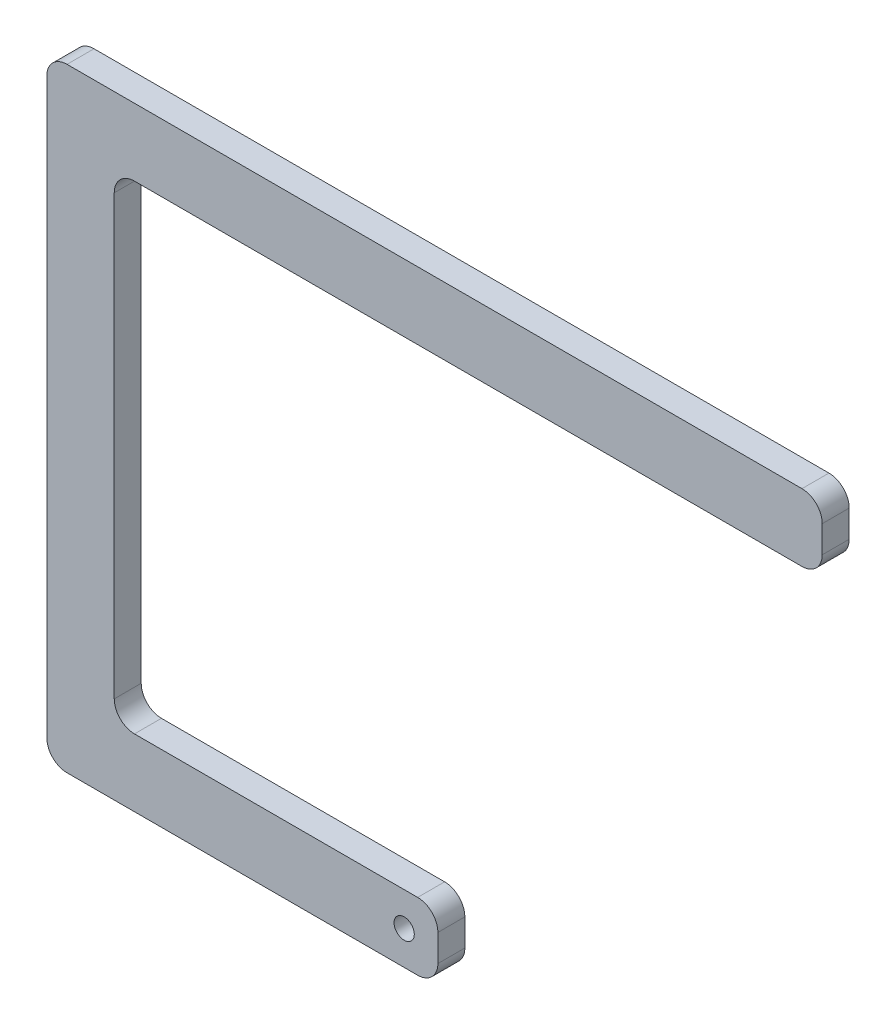
ISO-10303-21;
HEADER;
FILE_DESCRIPTION(('STEP AP214'),'2;1');
FILE_NAME('part.step','',(''),(''),'','','');
FILE_SCHEMA(('AUTOMOTIVE_DESIGN { 1 0 10303 214 1 1 1 1 }'));
ENDSEC;
DATA;
#1=APPLICATION_CONTEXT('core data for automotive mechanical design processes');
#2=APPLICATION_PROTOCOL_DEFINITION('international standard','automotive_design',2000,#1);
#3=PRODUCT_CONTEXT('',#1,'mechanical');
#4=PRODUCT('Part','Part','',(#3));
#5=PRODUCT_RELATED_PRODUCT_CATEGORY('part','',(#4));
#6=PRODUCT_DEFINITION_FORMATION('','',#4);
#7=PRODUCT_DEFINITION_CONTEXT('part definition',#1,'design');
#8=PRODUCT_DEFINITION('design','',#6,#7);
#9=PRODUCT_DEFINITION_SHAPE('','',#8);
#10=(LENGTH_UNIT() NAMED_UNIT(*) SI_UNIT(.MILLI.,.METRE.));
#11=(NAMED_UNIT(*) PLANE_ANGLE_UNIT() SI_UNIT($,.RADIAN.));
#12=(NAMED_UNIT(*) SI_UNIT($,.STERADIAN.) SOLID_ANGLE_UNIT());
#13=UNCERTAINTY_MEASURE_WITH_UNIT(LENGTH_MEASURE(1.E-05),#10,'distance_accuracy_value','');
#14=(GEOMETRIC_REPRESENTATION_CONTEXT(3) GLOBAL_UNCERTAINTY_ASSIGNED_CONTEXT((#13)) GLOBAL_UNIT_ASSIGNED_CONTEXT((#10,
#11,#12)) REPRESENTATION_CONTEXT('',''));
#15=CARTESIAN_POINT('',(0.,0.,0.));
#16=DIRECTION('',(0.,0.,1.));
#17=DIRECTION('',(1.,0.,0.));
#18=AXIS2_PLACEMENT_3D('',#15,#16,#17);
#19=CARTESIAN_POINT('',(-55.,78.,4.));
#20=DIRECTION('',(0.,0.,-1.));
#21=DIRECTION('',(-1.,0.,0.));
#22=AXIS2_PLACEMENT_3D('',#19,#20,#21);
#23=PLANE('',#22);
#24=CARTESIAN_POINT('',(-55.,78.,4.));
#25=DIRECTION('',(0.,0.,1.));
#26=DIRECTION('',(-1.,0.,0.));
#27=AXIS2_PLACEMENT_3D('',#24,#25,#26);
#28=CIRCLE('',#27,3.);
#29=CARTESIAN_POINT('',(-55.,81.,4.));
#30=VERTEX_POINT('',#29);
#31=CARTESIAN_POINT('',(-58.,78.,4.));
#32=VERTEX_POINT('',#31);
#33=EDGE_CURVE('E209',#30,#32,#28,.T.);
#34=ORIENTED_EDGE('',*,*,#33,.T.);
#35=DIRECTION('',(0.,-1.,0.));
#36=VECTOR('',#35,1.);
#37=CARTESIAN_POINT('',(-58.,-7.00000000000001,4.));
#38=LINE('',#37,#36);
#39=CARTESIAN_POINT('',(-58.,-7.00000000000001,4.));
#40=VERTEX_POINT('',#39);
#41=EDGE_CURVE('E117',#32,#40,#38,.T.);
#42=ORIENTED_EDGE('',*,*,#41,.T.);
#43=CARTESIAN_POINT('',(-55.,-7.00000000000001,4.));
#44=DIRECTION('',(0.,0.,1.));
#45=DIRECTION('',(-1.,0.,0.));
#46=AXIS2_PLACEMENT_3D('',#43,#44,#45);
#47=CIRCLE('',#46,3.);
#48=CARTESIAN_POINT('',(-55.,-10.,4.));
#49=VERTEX_POINT('',#48);
#50=EDGE_CURVE('E248',#40,#49,#47,.T.);
#51=ORIENTED_EDGE('',*,*,#50,.T.);
#52=DIRECTION('',(1.,0.,0.));
#53=VECTOR('',#52,1.);
#54=CARTESIAN_POINT('',(-3.00000000000002,-10.,4.));
#55=LINE('',#54,#53);
#56=CARTESIAN_POINT('',(-3.00000000000002,-10.,4.));
#57=VERTEX_POINT('',#56);
#58=EDGE_CURVE('E267',#49,#57,#55,.T.);
#59=ORIENTED_EDGE('',*,*,#58,.T.);
#60=CARTESIAN_POINT('',(-3.,-7.,4.));
#61=DIRECTION('',(0.,0.,1.));
#62=DIRECTION('',(1.,0.,0.));
#63=AXIS2_PLACEMENT_3D('',#60,#61,#62);
#64=CIRCLE('',#63,3.);
#65=CARTESIAN_POINT('',(0.,-7.,4.));
#66=VERTEX_POINT('',#65);
#67=EDGE_CURVE('E264',#57,#66,#64,.T.);
#68=ORIENTED_EDGE('',*,*,#67,.T.);
#69=DIRECTION('',(0.,1.,0.));
#70=VECTOR('',#69,1.);
#71=CARTESIAN_POINT('',(0.,-3.,4.));
#72=LINE('',#71,#70);
#73=CARTESIAN_POINT('',(0.,-3.,4.));
#74=VERTEX_POINT('',#73);
#75=EDGE_CURVE('E266',#66,#74,#72,.T.);
#76=ORIENTED_EDGE('',*,*,#75,.T.);
#77=CARTESIAN_POINT('',(-3.,-3.,4.));
#78=DIRECTION('',(0.,0.,1.));
#79=DIRECTION('',(-1.,0.,0.));
#80=AXIS2_PLACEMENT_3D('',#77,#78,#79);
#81=CIRCLE('',#80,3.);
#82=CARTESIAN_POINT('',(-3.,0.,4.));
#83=VERTEX_POINT('',#82);
#84=EDGE_CURVE('E269',#74,#83,#81,.T.);
#85=ORIENTED_EDGE('',*,*,#84,.T.);
#86=DIRECTION('',(-1.,0.,0.));
#87=VECTOR('',#86,1.);
#88=CARTESIAN_POINT('',(-3.,0.,4.));
#89=LINE('',#88,#87);
#90=CARTESIAN_POINT('',(-45.,0.,4.));
#91=VERTEX_POINT('',#90);
#92=EDGE_CURVE('E275',#83,#91,#89,.T.);
#93=ORIENTED_EDGE('',*,*,#92,.T.);
#94=CARTESIAN_POINT('',(-45.,2.99999999999999,4.));
#95=DIRECTION('',(0.,0.,-1.));
#96=DIRECTION('',(-1.,0.,0.));
#97=AXIS2_PLACEMENT_3D('',#94,#95,#96);
#98=CIRCLE('',#97,3.);
#99=CARTESIAN_POINT('',(-48.,2.99999999999999,4.));
#100=VERTEX_POINT('',#99);
#101=EDGE_CURVE('E277',#91,#100,#98,.T.);
#102=ORIENTED_EDGE('',*,*,#101,.T.);
#103=DIRECTION('',(0.,1.,0.));
#104=VECTOR('',#103,1.);
#105=CARTESIAN_POINT('',(-48.,2.99999999999999,4.));
#106=LINE('',#105,#104);
#107=CARTESIAN_POINT('',(-48.,68.,4.));
#108=VERTEX_POINT('',#107);
#109=EDGE_CURVE('E279',#100,#108,#106,.T.);
#110=ORIENTED_EDGE('',*,*,#109,.T.);
#111=CARTESIAN_POINT('',(-45.,68.,4.));
#112=DIRECTION('',(0.,0.,-1.));
#113=DIRECTION('',(-1.,0.,0.));
#114=AXIS2_PLACEMENT_3D('',#111,#112,#113);
#115=CIRCLE('',#114,3.);
#116=CARTESIAN_POINT('',(-45.,71.,4.));
#117=VERTEX_POINT('',#116);
#118=EDGE_CURVE('E281',#108,#117,#115,.T.);
#119=ORIENTED_EDGE('',*,*,#118,.T.);
#120=DIRECTION('',(1.,0.,0.));
#121=VECTOR('',#120,1.);
#122=CARTESIAN_POINT('',(-45.,71.,4.));
#123=LINE('',#122,#121);
#124=CARTESIAN_POINT('',(54.,71.,4.));
#125=VERTEX_POINT('',#124);
#126=EDGE_CURVE('E283',#117,#125,#123,.T.);
#127=ORIENTED_EDGE('',*,*,#126,.T.);
#128=CARTESIAN_POINT('',(54.,74.,4.));
#129=DIRECTION('',(0.,0.,1.));
#130=DIRECTION('',(1.,0.,0.));
#131=AXIS2_PLACEMENT_3D('',#128,#129,#130);
#132=CIRCLE('',#131,3.);
#133=CARTESIAN_POINT('',(57.,74.,4.));
#134=VERTEX_POINT('',#133);
#135=EDGE_CURVE('E160',#125,#134,#132,.T.);
#136=ORIENTED_EDGE('',*,*,#135,.T.);
#137=DIRECTION('',(0.,1.,0.));
#138=VECTOR('',#137,1.);
#139=CARTESIAN_POINT('',(57.,74.,4.));
#140=LINE('',#139,#138);
#141=CARTESIAN_POINT('',(57.,78.,4.));
#142=VERTEX_POINT('',#141);
#143=EDGE_CURVE('E154',#134,#142,#140,.T.);
#144=ORIENTED_EDGE('',*,*,#143,.T.);
#145=CARTESIAN_POINT('',(54.,78.,4.));
#146=DIRECTION('',(0.,0.,1.));
#147=DIRECTION('',(-1.,0.,0.));
#148=AXIS2_PLACEMENT_3D('',#145,#146,#147);
#149=CIRCLE('',#148,3.);
#150=CARTESIAN_POINT('',(54.,81.,4.));
#151=VERTEX_POINT('',#150);
#152=EDGE_CURVE('E158',#142,#151,#149,.T.);
#153=ORIENTED_EDGE('',*,*,#152,.T.);
#154=DIRECTION('',(-1.,0.,0.));
#155=VECTOR('',#154,1.);
#156=CARTESIAN_POINT('',(-55.,81.,4.));
#157=LINE('',#156,#155);
#158=EDGE_CURVE('E50',#151,#30,#157,.T.);
#159=ORIENTED_EDGE('',*,*,#158,.T.);
#160=EDGE_LOOP('',(#34,#42,#51,#59,#68,#76,#85,#93,#102,#110,#119,#127,#136,#144,#153,#159));
#161=FACE_BOUND('',#160,.T.);
#162=CARTESIAN_POINT('',(-5.,-5.,4.));
#163=DIRECTION('',(0.,0.,1.));
#164=DIRECTION('',(1.,0.,0.));
#165=AXIS2_PLACEMENT_3D('',#162,#163,#164);
#166=CIRCLE('',#165,1.5);
#167=CARTESIAN_POINT('',(-3.5,-5.,4.));
#168=VERTEX_POINT('',#167);
#169=EDGE_CURVE('E182',#168,#168,#166,.T.);
#170=ORIENTED_EDGE('',*,*,#169,.F.);
#171=EDGE_LOOP('',(#170));
#172=FACE_BOUND('',#171,.T.);
#173=ADVANCED_FACE('F33',(#161,#172),#23,.F.);
#174=CARTESIAN_POINT('',(-55.,78.,0.));
#175=DIRECTION('',(0.,0.,-1.));
#176=DIRECTION('',(-1.,0.,0.));
#177=AXIS2_PLACEMENT_3D('',#174,#175,#176);
#178=PLANE('',#177);
#179=CARTESIAN_POINT('',(-55.,78.,0.));
#180=DIRECTION('',(0.,0.,1.));
#181=DIRECTION('',(-1.,0.,0.));
#182=AXIS2_PLACEMENT_3D('',#179,#180,#181);
#183=CIRCLE('',#182,3.);
#184=CARTESIAN_POINT('',(-55.,81.,0.));
#185=VERTEX_POINT('',#184);
#186=CARTESIAN_POINT('',(-58.,78.,0.));
#187=VERTEX_POINT('',#186);
#188=EDGE_CURVE('E178',#185,#187,#183,.T.);
#189=ORIENTED_EDGE('',*,*,#188,.F.);
#190=DIRECTION('',(-1.,0.,0.));
#191=VECTOR('',#190,1.);
#192=CARTESIAN_POINT('',(-55.,81.,0.));
#193=LINE('',#192,#191);
#194=CARTESIAN_POINT('',(54.,81.,0.));
#195=VERTEX_POINT('',#194);
#196=EDGE_CURVE('E109',#195,#185,#193,.T.);
#197=ORIENTED_EDGE('',*,*,#196,.F.);
#198=CARTESIAN_POINT('',(54.,78.,0.));
#199=DIRECTION('',(0.,0.,1.));
#200=DIRECTION('',(-1.,0.,0.));
#201=AXIS2_PLACEMENT_3D('',#198,#199,#200);
#202=CIRCLE('',#201,3.);
#203=CARTESIAN_POINT('',(57.,78.,0.));
#204=VERTEX_POINT('',#203);
#205=EDGE_CURVE('E103',#204,#195,#202,.T.);
#206=ORIENTED_EDGE('',*,*,#205,.F.);
#207=DIRECTION('',(0.,1.,0.));
#208=VECTOR('',#207,1.);
#209=CARTESIAN_POINT('',(57.,74.,0.));
#210=LINE('',#209,#208);
#211=CARTESIAN_POINT('',(57.,74.,0.));
#212=VERTEX_POINT('',#211);
#213=EDGE_CURVE('E168',#212,#204,#210,.T.);
#214=ORIENTED_EDGE('',*,*,#213,.F.);
#215=CARTESIAN_POINT('',(54.,74.,0.));
#216=DIRECTION('',(0.,0.,1.));
#217=DIRECTION('',(1.,0.,0.));
#218=AXIS2_PLACEMENT_3D('',#215,#216,#217);
#219=CIRCLE('',#218,3.);
#220=CARTESIAN_POINT('',(54.,71.,0.));
#221=VERTEX_POINT('',#220);
#222=EDGE_CURVE('E204',#221,#212,#219,.T.);
#223=ORIENTED_EDGE('',*,*,#222,.F.);
#224=DIRECTION('',(1.,0.,0.));
#225=VECTOR('',#224,1.);
#226=CARTESIAN_POINT('',(-45.,71.,0.));
#227=LINE('',#226,#225);
#228=CARTESIAN_POINT('',(-45.,71.,0.));
#229=VERTEX_POINT('',#228);
#230=EDGE_CURVE('E202',#229,#221,#227,.T.);
#231=ORIENTED_EDGE('',*,*,#230,.F.);
#232=CARTESIAN_POINT('',(-45.,68.,0.));
#233=DIRECTION('',(0.,0.,-1.));
#234=DIRECTION('',(-1.,0.,0.));
#235=AXIS2_PLACEMENT_3D('',#232,#233,#234);
#236=CIRCLE('',#235,3.);
#237=CARTESIAN_POINT('',(-48.,68.,0.));
#238=VERTEX_POINT('',#237);
#239=EDGE_CURVE('E200',#238,#229,#236,.T.);
#240=ORIENTED_EDGE('',*,*,#239,.F.);
#241=DIRECTION('',(0.,1.,0.));
#242=VECTOR('',#241,1.);
#243=CARTESIAN_POINT('',(-48.,2.99999999999999,0.));
#244=LINE('',#243,#242);
#245=CARTESIAN_POINT('',(-48.,2.99999999999999,0.));
#246=VERTEX_POINT('',#245);
#247=EDGE_CURVE('E198',#246,#238,#244,.T.);
#248=ORIENTED_EDGE('',*,*,#247,.F.);
#249=CARTESIAN_POINT('',(-45.,2.99999999999999,0.));
#250=DIRECTION('',(0.,0.,-1.));
#251=DIRECTION('',(-1.,0.,0.));
#252=AXIS2_PLACEMENT_3D('',#249,#250,#251);
#253=CIRCLE('',#252,3.);
#254=CARTESIAN_POINT('',(-45.,0.,0.));
#255=VERTEX_POINT('',#254);
#256=EDGE_CURVE('E196',#255,#246,#253,.T.);
#257=ORIENTED_EDGE('',*,*,#256,.F.);
#258=DIRECTION('',(-1.,0.,0.));
#259=VECTOR('',#258,1.);
#260=CARTESIAN_POINT('',(-3.,0.,0.));
#261=LINE('',#260,#259);
#262=CARTESIAN_POINT('',(-3.,0.,0.));
#263=VERTEX_POINT('',#262);
#264=EDGE_CURVE('E194',#263,#255,#261,.T.);
#265=ORIENTED_EDGE('',*,*,#264,.F.);
#266=CARTESIAN_POINT('',(-3.,-3.,0.));
#267=DIRECTION('',(0.,0.,1.));
#268=DIRECTION('',(-1.,0.,0.));
#269=AXIS2_PLACEMENT_3D('',#266,#267,#268);
#270=CIRCLE('',#269,3.);
#271=CARTESIAN_POINT('',(0.,-3.,0.));
#272=VERTEX_POINT('',#271);
#273=EDGE_CURVE('E192',#272,#263,#270,.T.);
#274=ORIENTED_EDGE('',*,*,#273,.F.);
#275=DIRECTION('',(0.,1.,0.));
#276=VECTOR('',#275,1.);
#277=CARTESIAN_POINT('',(0.,-3.,0.));
#278=LINE('',#277,#276);
#279=CARTESIAN_POINT('',(0.,-7.,0.));
#280=VERTEX_POINT('',#279);
#281=EDGE_CURVE('E190',#280,#272,#278,.T.);
#282=ORIENTED_EDGE('',*,*,#281,.F.);
#283=CARTESIAN_POINT('',(-3.,-7.,0.));
#284=DIRECTION('',(0.,0.,1.));
#285=DIRECTION('',(1.,0.,0.));
#286=AXIS2_PLACEMENT_3D('',#283,#284,#285);
#287=CIRCLE('',#286,3.);
#288=CARTESIAN_POINT('',(-3.00000000000002,-10.,0.));
#289=VERTEX_POINT('',#288);
#290=EDGE_CURVE('E188',#289,#280,#287,.T.);
#291=ORIENTED_EDGE('',*,*,#290,.F.);
#292=DIRECTION('',(1.,0.,0.));
#293=VECTOR('',#292,1.);
#294=CARTESIAN_POINT('',(-3.00000000000002,-10.,0.));
#295=LINE('',#294,#293);
#296=CARTESIAN_POINT('',(-55.,-10.,0.));
#297=VERTEX_POINT('',#296);
#298=EDGE_CURVE('E186',#297,#289,#295,.T.);
#299=ORIENTED_EDGE('',*,*,#298,.F.);
#300=CARTESIAN_POINT('',(-55.,-7.00000000000001,0.));
#301=DIRECTION('',(0.,0.,1.));
#302=DIRECTION('',(-1.,0.,0.));
#303=AXIS2_PLACEMENT_3D('',#300,#301,#302);
#304=CIRCLE('',#303,3.);
#305=CARTESIAN_POINT('',(-58.,-7.00000000000001,0.));
#306=VERTEX_POINT('',#305);
#307=EDGE_CURVE('E184',#306,#297,#304,.T.);
#308=ORIENTED_EDGE('',*,*,#307,.F.);
#309=DIRECTION('',(0.,-1.,0.));
#310=VECTOR('',#309,1.);
#311=CARTESIAN_POINT('',(-58.,-7.00000000000001,0.));
#312=LINE('',#311,#310);
#313=EDGE_CURVE('E181',#187,#306,#312,.T.);
#314=ORIENTED_EDGE('',*,*,#313,.F.);
#315=EDGE_LOOP('',(#189,#197,#206,#214,#223,#231,#240,#248,#257,#265,#274,#282,#291,#299,#308,#314));
#316=FACE_BOUND('',#315,.T.);
#317=CARTESIAN_POINT('',(-5.,-5.,0.));
#318=DIRECTION('',(0.,0.,1.));
#319=DIRECTION('',(1.,0.,0.));
#320=AXIS2_PLACEMENT_3D('',#317,#318,#319);
#321=CIRCLE('',#320,1.5);
#322=CARTESIAN_POINT('',(-3.5,-5.,0.));
#323=VERTEX_POINT('',#322);
#324=EDGE_CURVE('E482',#323,#323,#321,.T.);
#325=ORIENTED_EDGE('',*,*,#324,.T.);
#326=EDGE_LOOP('',(#325));
#327=FACE_BOUND('',#326,.T.);
#328=ADVANCED_FACE('F252',(#316,#327),#178,.T.);
#329=CARTESIAN_POINT('',(-55.,78.,4.));
#330=DIRECTION('',(0.,0.,-1.));
#331=DIRECTION('',(-1.,0.,0.));
#332=AXIS2_PLACEMENT_3D('',#329,#330,#331);
#333=CYLINDRICAL_SURFACE('',#332,3.);
#334=ORIENTED_EDGE('',*,*,#188,.T.);
#335=DIRECTION('',(0.,0.,-1.));
#336=VECTOR('',#335,1.);
#337=CARTESIAN_POINT('',(-58.,78.,4.));
#338=LINE('',#337,#336);
#339=EDGE_CURVE('E11',#32,#187,#338,.T.);
#340=ORIENTED_EDGE('',*,*,#339,.F.);
#341=ORIENTED_EDGE('',*,*,#33,.F.);
#342=DIRECTION('',(0.,0.,-1.));
#343=VECTOR('',#342,1.);
#344=CARTESIAN_POINT('',(-55.,81.,4.));
#345=LINE('',#344,#343);
#346=EDGE_CURVE('E174',#30,#185,#345,.T.);
#347=ORIENTED_EDGE('',*,*,#346,.T.);
#348=EDGE_LOOP('',(#334,#340,#341,#347));
#349=FACE_BOUND('',#348,.T.);
#350=ADVANCED_FACE('F35',(#349),#333,.T.);
#351=CARTESIAN_POINT('',(-58.,-7.00000000000001,4.));
#352=DIRECTION('',(1.,0.,0.));
#353=DIRECTION('',(0.,0.,-1.));
#354=AXIS2_PLACEMENT_3D('',#351,#352,#353);
#355=PLANE('',#354);
#356=ORIENTED_EDGE('',*,*,#313,.T.);
#357=DIRECTION('',(0.,0.,-1.));
#358=VECTOR('',#357,1.);
#359=CARTESIAN_POINT('',(-58.,-7.00000000000001,4.));
#360=LINE('',#359,#358);
#361=EDGE_CURVE('E42',#40,#306,#360,.T.);
#362=ORIENTED_EDGE('',*,*,#361,.F.);
#363=ORIENTED_EDGE('',*,*,#41,.F.);
#364=ORIENTED_EDGE('',*,*,#339,.T.);
#365=EDGE_LOOP('',(#356,#362,#363,#364));
#366=FACE_BOUND('',#365,.T.);
#367=ADVANCED_FACE('F317',(#366),#355,.F.);
#368=CARTESIAN_POINT('',(-55.,-7.00000000000001,4.));
#369=DIRECTION('',(0.,0.,-1.));
#370=DIRECTION('',(-1.,0.,0.));
#371=AXIS2_PLACEMENT_3D('',#368,#369,#370);
#372=CYLINDRICAL_SURFACE('',#371,3.);
#373=ORIENTED_EDGE('',*,*,#307,.T.);
#374=DIRECTION('',(0.,0.,-1.));
#375=VECTOR('',#374,1.);
#376=CARTESIAN_POINT('',(-55.,-10.,4.));
#377=LINE('',#376,#375);
#378=EDGE_CURVE('E240',#49,#297,#377,.T.);
#379=ORIENTED_EDGE('',*,*,#378,.F.);
#380=ORIENTED_EDGE('',*,*,#50,.F.);
#381=ORIENTED_EDGE('',*,*,#361,.T.);
#382=EDGE_LOOP('',(#373,#379,#380,#381));
#383=FACE_BOUND('',#382,.T.);
#384=ADVANCED_FACE('F246',(#383),#372,.T.);
#385=CARTESIAN_POINT('',(-3.00000000000002,-10.,4.));
#386=DIRECTION('',(0.,1.,0.));
#387=DIRECTION('',(-1.,0.,0.));
#388=AXIS2_PLACEMENT_3D('',#385,#386,#387);
#389=PLANE('',#388);
#390=ORIENTED_EDGE('',*,*,#298,.T.);
#391=DIRECTION('',(0.,0.,-1.));
#392=VECTOR('',#391,1.);
#393=CARTESIAN_POINT('',(-3.00000000000002,-10.,4.));
#394=LINE('',#393,#392);
#395=EDGE_CURVE('E237',#57,#289,#394,.T.);
#396=ORIENTED_EDGE('',*,*,#395,.F.);
#397=ORIENTED_EDGE('',*,*,#58,.F.);
#398=ORIENTED_EDGE('',*,*,#378,.T.);
#399=EDGE_LOOP('',(#390,#396,#397,#398));
#400=FACE_BOUND('',#399,.T.);
#401=ADVANCED_FACE('F258',(#400),#389,.F.);
#402=CARTESIAN_POINT('',(-3.,-7.,4.));
#403=DIRECTION('',(0.,0.,-1.));
#404=DIRECTION('',(-1.,0.,0.));
#405=AXIS2_PLACEMENT_3D('',#402,#403,#404);
#406=CYLINDRICAL_SURFACE('',#405,3.);
#407=ORIENTED_EDGE('',*,*,#290,.T.);
#408=DIRECTION('',(0.,0.,-1.));
#409=VECTOR('',#408,1.);
#410=CARTESIAN_POINT('',(0.,-7.,4.));
#411=LINE('',#410,#409);
#412=EDGE_CURVE('E234',#66,#280,#411,.T.);
#413=ORIENTED_EDGE('',*,*,#412,.F.);
#414=ORIENTED_EDGE('',*,*,#67,.F.);
#415=ORIENTED_EDGE('',*,*,#395,.T.);
#416=EDGE_LOOP('',(#407,#413,#414,#415));
#417=FACE_BOUND('',#416,.T.);
#418=ADVANCED_FACE('F262',(#417),#406,.T.);
#419=CARTESIAN_POINT('',(0.,-3.,4.));
#420=DIRECTION('',(-1.,0.,0.));
#421=DIRECTION('',(0.,-1.,0.));
#422=AXIS2_PLACEMENT_3D('',#419,#420,#421);
#423=PLANE('',#422);
#424=ORIENTED_EDGE('',*,*,#281,.T.);
#425=DIRECTION('',(0.,0.,-1.));
#426=VECTOR('',#425,1.);
#427=CARTESIAN_POINT('',(0.,-3.,4.));
#428=LINE('',#427,#426);
#429=EDGE_CURVE('E231',#74,#272,#428,.T.);
#430=ORIENTED_EDGE('',*,*,#429,.F.);
#431=ORIENTED_EDGE('',*,*,#75,.F.);
#432=ORIENTED_EDGE('',*,*,#412,.T.);
#433=EDGE_LOOP('',(#424,#430,#431,#432));
#434=FACE_BOUND('',#433,.T.);
#435=ADVANCED_FACE('F330',(#434),#423,.F.);
#436=CARTESIAN_POINT('',(-3.,-3.,4.));
#437=DIRECTION('',(0.,0.,-1.));
#438=DIRECTION('',(-1.,0.,0.));
#439=AXIS2_PLACEMENT_3D('',#436,#437,#438);
#440=CYLINDRICAL_SURFACE('',#439,3.);
#441=ORIENTED_EDGE('',*,*,#273,.T.);
#442=DIRECTION('',(0.,0.,-1.));
#443=VECTOR('',#442,1.);
#444=CARTESIAN_POINT('',(-3.,0.,4.));
#445=LINE('',#444,#443);
#446=EDGE_CURVE('E228',#83,#263,#445,.T.);
#447=ORIENTED_EDGE('',*,*,#446,.F.);
#448=ORIENTED_EDGE('',*,*,#84,.F.);
#449=ORIENTED_EDGE('',*,*,#429,.T.);
#450=EDGE_LOOP('',(#441,#447,#448,#449));
#451=FACE_BOUND('',#450,.T.);
#452=ADVANCED_FACE('F333',(#451),#440,.T.);
#453=CARTESIAN_POINT('',(-3.,0.,4.));
#454=DIRECTION('',(0.,-1.,0.));
#455=DIRECTION('',(1.,0.,0.));
#456=AXIS2_PLACEMENT_3D('',#453,#454,#455);
#457=PLANE('',#456);
#458=ORIENTED_EDGE('',*,*,#264,.T.);
#459=DIRECTION('',(0.,0.,-1.));
#460=VECTOR('',#459,1.);
#461=CARTESIAN_POINT('',(-45.,0.,4.));
#462=LINE('',#461,#460);
#463=EDGE_CURVE('E225',#91,#255,#462,.T.);
#464=ORIENTED_EDGE('',*,*,#463,.F.);
#465=ORIENTED_EDGE('',*,*,#92,.F.);
#466=ORIENTED_EDGE('',*,*,#446,.T.);
#467=EDGE_LOOP('',(#458,#464,#465,#466));
#468=FACE_BOUND('',#467,.T.);
#469=ADVANCED_FACE('F337',(#468),#457,.F.);
#470=CARTESIAN_POINT('',(-45.,2.99999999999999,4.));
#471=DIRECTION('',(0.,0.,-1.));
#472=DIRECTION('',(-1.,0.,0.));
#473=AXIS2_PLACEMENT_3D('',#470,#471,#472);
#474=CYLINDRICAL_SURFACE('',#473,3.);
#475=ORIENTED_EDGE('',*,*,#256,.T.);
#476=DIRECTION('',(0.,0.,-1.));
#477=VECTOR('',#476,1.);
#478=CARTESIAN_POINT('',(-48.,2.99999999999999,4.));
#479=LINE('',#478,#477);
#480=EDGE_CURVE('E222',#100,#246,#479,.T.);
#481=ORIENTED_EDGE('',*,*,#480,.F.);
#482=ORIENTED_EDGE('',*,*,#101,.F.);
#483=ORIENTED_EDGE('',*,*,#463,.T.);
#484=EDGE_LOOP('',(#475,#481,#482,#483));
#485=FACE_BOUND('',#484,.T.);
#486=ADVANCED_FACE('F341',(#485),#474,.F.);
#487=CARTESIAN_POINT('',(-48.,2.99999999999999,4.));
#488=DIRECTION('',(-1.,0.,0.));
#489=DIRECTION('',(0.,0.,1.));
#490=AXIS2_PLACEMENT_3D('',#487,#488,#489);
#491=PLANE('',#490);
#492=ORIENTED_EDGE('',*,*,#247,.T.);
#493=DIRECTION('',(0.,0.,-1.));
#494=VECTOR('',#493,1.);
#495=CARTESIAN_POINT('',(-48.,68.,4.));
#496=LINE('',#495,#494);
#497=EDGE_CURVE('E219',#108,#238,#496,.T.);
#498=ORIENTED_EDGE('',*,*,#497,.F.);
#499=ORIENTED_EDGE('',*,*,#109,.F.);
#500=ORIENTED_EDGE('',*,*,#480,.T.);
#501=EDGE_LOOP('',(#492,#498,#499,#500));
#502=FACE_BOUND('',#501,.T.);
#503=ADVANCED_FACE('F345',(#502),#491,.F.);
#504=CARTESIAN_POINT('',(-45.,68.,4.));
#505=DIRECTION('',(0.,0.,-1.));
#506=DIRECTION('',(-1.,0.,0.));
#507=AXIS2_PLACEMENT_3D('',#504,#505,#506);
#508=CYLINDRICAL_SURFACE('',#507,3.);
#509=ORIENTED_EDGE('',*,*,#239,.T.);
#510=DIRECTION('',(0.,0.,-1.));
#511=VECTOR('',#510,1.);
#512=CARTESIAN_POINT('',(-45.,71.,4.));
#513=LINE('',#512,#511);
#514=EDGE_CURVE('E216',#117,#229,#513,.T.);
#515=ORIENTED_EDGE('',*,*,#514,.F.);
#516=ORIENTED_EDGE('',*,*,#118,.F.);
#517=ORIENTED_EDGE('',*,*,#497,.T.);
#518=EDGE_LOOP('',(#509,#515,#516,#517));
#519=FACE_BOUND('',#518,.T.);
#520=ADVANCED_FACE('F349',(#519),#508,.F.);
#521=CARTESIAN_POINT('',(-45.,71.,4.));
#522=DIRECTION('',(0.,1.,0.));
#523=DIRECTION('',(0.,0.,1.));
#524=AXIS2_PLACEMENT_3D('',#521,#522,#523);
#525=PLANE('',#524);
#526=ORIENTED_EDGE('',*,*,#230,.T.);
#527=DIRECTION('',(0.,0.,-1.));
#528=VECTOR('',#527,1.);
#529=CARTESIAN_POINT('',(54.,71.,4.));
#530=LINE('',#529,#528);
#531=EDGE_CURVE('E213',#125,#221,#530,.T.);
#532=ORIENTED_EDGE('',*,*,#531,.F.);
#533=ORIENTED_EDGE('',*,*,#126,.F.);
#534=ORIENTED_EDGE('',*,*,#514,.T.);
#535=EDGE_LOOP('',(#526,#532,#533,#534));
#536=FACE_BOUND('',#535,.T.);
#537=ADVANCED_FACE('F289',(#536),#525,.F.);
#538=CARTESIAN_POINT('',(54.,74.,4.));
#539=DIRECTION('',(0.,0.,-1.));
#540=DIRECTION('',(-1.,0.,0.));
#541=AXIS2_PLACEMENT_3D('',#538,#539,#540);
#542=CYLINDRICAL_SURFACE('',#541,3.);
#543=ORIENTED_EDGE('',*,*,#222,.T.);
#544=DIRECTION('',(0.,0.,-1.));
#545=VECTOR('',#544,1.);
#546=CARTESIAN_POINT('',(57.,74.,4.));
#547=LINE('',#546,#545);
#548=EDGE_CURVE('E169',#134,#212,#547,.T.);
#549=ORIENTED_EDGE('',*,*,#548,.F.);
#550=ORIENTED_EDGE('',*,*,#135,.F.);
#551=ORIENTED_EDGE('',*,*,#531,.T.);
#552=EDGE_LOOP('',(#543,#549,#550,#551));
#553=FACE_BOUND('',#552,.T.);
#554=ADVANCED_FACE('F293',(#553),#542,.T.);
#555=CARTESIAN_POINT('',(57.,74.,4.));
#556=DIRECTION('',(-1.,0.,0.));
#557=DIRECTION('',(0.,-1.,0.));
#558=AXIS2_PLACEMENT_3D('',#555,#556,#557);
#559=PLANE('',#558);
#560=ORIENTED_EDGE('',*,*,#213,.T.);
#561=DIRECTION('',(0.,0.,-1.));
#562=VECTOR('',#561,1.);
#563=CARTESIAN_POINT('',(57.,78.,4.));
#564=LINE('',#563,#562);
#565=EDGE_CURVE('E165',#142,#204,#564,.T.);
#566=ORIENTED_EDGE('',*,*,#565,.F.);
#567=ORIENTED_EDGE('',*,*,#143,.F.);
#568=ORIENTED_EDGE('',*,*,#548,.T.);
#569=EDGE_LOOP('',(#560,#566,#567,#568));
#570=FACE_BOUND('',#569,.T.);
#571=ADVANCED_FACE('F166',(#570),#559,.F.);
#572=CARTESIAN_POINT('',(54.,78.,4.));
#573=DIRECTION('',(0.,0.,-1.));
#574=DIRECTION('',(-1.,0.,0.));
#575=AXIS2_PLACEMENT_3D('',#572,#573,#574);
#576=CYLINDRICAL_SURFACE('',#575,3.);
#577=ORIENTED_EDGE('',*,*,#205,.T.);
#578=DIRECTION('',(0.,0.,-1.));
#579=VECTOR('',#578,1.);
#580=CARTESIAN_POINT('',(54.,81.,4.));
#581=LINE('',#580,#579);
#582=EDGE_CURVE('E170',#151,#195,#581,.T.);
#583=ORIENTED_EDGE('',*,*,#582,.F.);
#584=ORIENTED_EDGE('',*,*,#152,.F.);
#585=ORIENTED_EDGE('',*,*,#565,.T.);
#586=EDGE_LOOP('',(#577,#583,#584,#585));
#587=FACE_BOUND('',#586,.T.);
#588=ADVANCED_FACE('F172',(#587),#576,.T.);
#589=CARTESIAN_POINT('',(-55.,81.,4.));
#590=DIRECTION('',(0.,-1.,0.));
#591=DIRECTION('',(0.,0.,-1.));
#592=AXIS2_PLACEMENT_3D('',#589,#590,#591);
#593=PLANE('',#592);
#594=ORIENTED_EDGE('',*,*,#196,.T.);
#595=ORIENTED_EDGE('',*,*,#346,.F.);
#596=ORIENTED_EDGE('',*,*,#158,.F.);
#597=ORIENTED_EDGE('',*,*,#582,.T.);
#598=EDGE_LOOP('',(#594,#595,#596,#597));
#599=FACE_BOUND('',#598,.T.);
#600=ADVANCED_FACE('F297',(#599),#593,.F.);
#601=CARTESIAN_POINT('',(-5.,-5.,4.));
#602=DIRECTION('',(0.,0.,-1.));
#603=DIRECTION('',(-1.,0.,0.));
#604=AXIS2_PLACEMENT_3D('',#601,#602,#603);
#605=CYLINDRICAL_SURFACE('',#604,1.5);
#606=ORIENTED_EDGE('',*,*,#169,.T.);
#607=EDGE_LOOP('',(#606));
#608=FACE_BOUND('',#607,.T.);
#609=ORIENTED_EDGE('',*,*,#324,.F.);
#610=EDGE_LOOP('',(#609));
#611=FACE_BOUND('',#610,.T.);
#612=ADVANCED_FACE('F299',(#608,#611),#605,.F.);
#613=CLOSED_SHELL('',(#173,#328,#350,#367,#384,#401,#418,#435,#452,#469,#486,#503,#520,#537,
#554,#571,#588,#600,#612));
#614=MANIFOLD_SOLID_BREP('B2',#613);
#615=ADVANCED_BREP_SHAPE_REPRESENTATION('',(#18,#614),#14);
#616=SHAPE_DEFINITION_REPRESENTATION(#9,#615);
ENDSEC;
END-ISO-10303-21;
